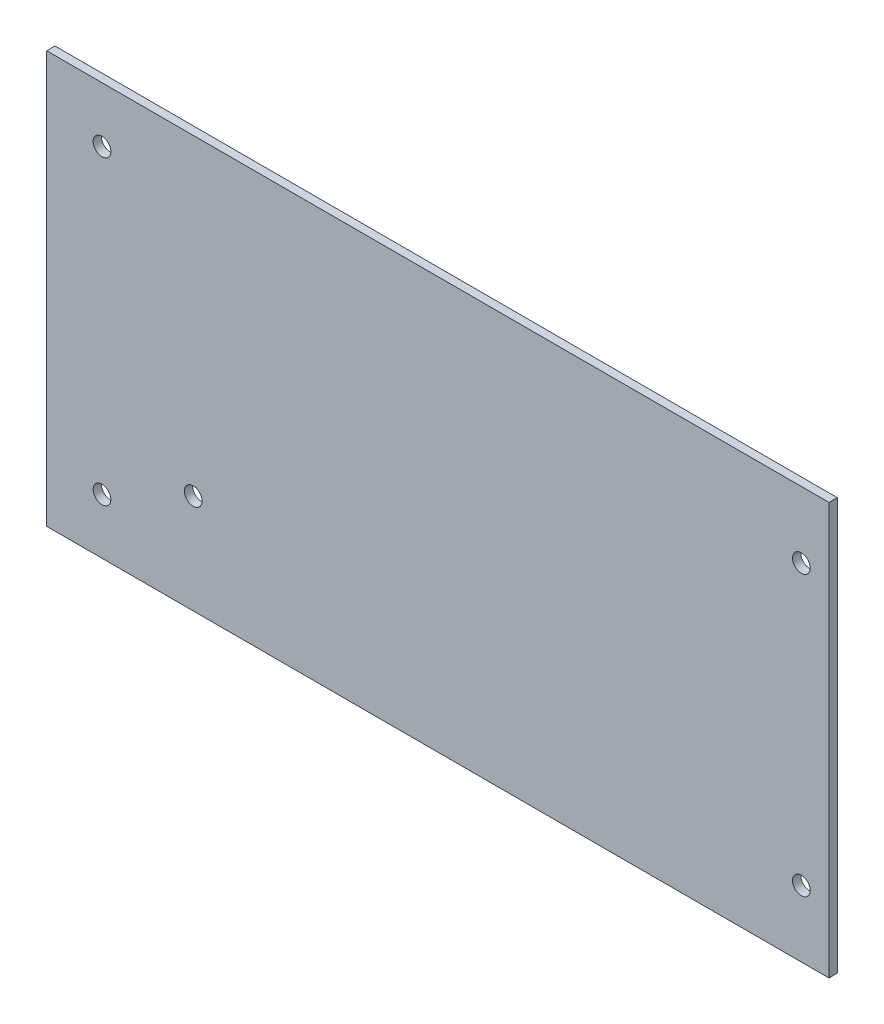
ISO-10303-21;
HEADER;
FILE_DESCRIPTION(('STEP AP214'),'2;1');
FILE_NAME('part.step','',(''),(''),'','','');
FILE_SCHEMA(('AUTOMOTIVE_DESIGN { 1 0 10303 214 1 1 1 1 }'));
ENDSEC;
DATA;
#1=APPLICATION_CONTEXT('core data for automotive mechanical design processes');
#2=APPLICATION_PROTOCOL_DEFINITION('international standard','automotive_design',2000,#1);
#3=PRODUCT_CONTEXT('',#1,'mechanical');
#4=PRODUCT('Part','Part','',(#3));
#5=PRODUCT_RELATED_PRODUCT_CATEGORY('part','',(#4));
#6=PRODUCT_DEFINITION_FORMATION('','',#4);
#7=PRODUCT_DEFINITION_CONTEXT('part definition',#1,'design');
#8=PRODUCT_DEFINITION('design','',#6,#7);
#9=PRODUCT_DEFINITION_SHAPE('','',#8);
#10=(LENGTH_UNIT() NAMED_UNIT(*) SI_UNIT(.MILLI.,.METRE.));
#11=(NAMED_UNIT(*) PLANE_ANGLE_UNIT() SI_UNIT($,.RADIAN.));
#12=(NAMED_UNIT(*) SI_UNIT($,.STERADIAN.) SOLID_ANGLE_UNIT());
#13=UNCERTAINTY_MEASURE_WITH_UNIT(LENGTH_MEASURE(1.E-05),#10,'distance_accuracy_value','');
#14=(GEOMETRIC_REPRESENTATION_CONTEXT(3) GLOBAL_UNCERTAINTY_ASSIGNED_CONTEXT((#13)) GLOBAL_UNIT_ASSIGNED_CONTEXT((#10,
#11,#12)) REPRESENTATION_CONTEXT('',''));
#15=CARTESIAN_POINT('',(0.,0.,0.));
#16=DIRECTION('',(0.,0.,1.));
#17=DIRECTION('',(1.,0.,0.));
#18=AXIS2_PLACEMENT_3D('',#15,#16,#17);
#19=CARTESIAN_POINT('',(-69.9627673140526,74.5,1.5));
#20=DIRECTION('',(1.,0.,0.));
#21=DIRECTION('',(0.,1.,0.));
#22=AXIS2_PLACEMENT_3D('',#19,#20,#21);
#23=PLANE('',#22);
#24=DIRECTION('',(0.,-1.,0.));
#25=VECTOR('',#24,1.);
#26=CARTESIAN_POINT('',(-69.9627673140526,74.5,0.));
#27=LINE('',#26,#25);
#28=CARTESIAN_POINT('',(-69.9627673140526,74.5,0.));
#29=VERTEX_POINT('',#28);
#30=CARTESIAN_POINT('',(-69.9627673140526,0.,0.));
#31=VERTEX_POINT('',#30);
#32=EDGE_CURVE('E95',#29,#31,#27,.T.);
#33=ORIENTED_EDGE('',*,*,#32,.T.);
#34=DIRECTION('',(0.,0.,-1.));
#35=VECTOR('',#34,1.);
#36=CARTESIAN_POINT('',(-69.9627673140526,0.,1.5));
#37=LINE('',#36,#35);
#38=CARTESIAN_POINT('',(-69.9627673140526,0.,1.5));
#39=VERTEX_POINT('',#38);
#40=EDGE_CURVE('E11',#39,#31,#37,.T.);
#41=ORIENTED_EDGE('',*,*,#40,.F.);
#42=DIRECTION('',(0.,-1.,0.));
#43=VECTOR('',#42,1.);
#44=CARTESIAN_POINT('',(-69.9627673140526,74.5,1.5));
#45=LINE('',#44,#43);
#46=CARTESIAN_POINT('',(-69.9627673140526,74.5,1.5));
#47=VERTEX_POINT('',#46);
#48=EDGE_CURVE('E83',#47,#39,#45,.T.);
#49=ORIENTED_EDGE('',*,*,#48,.F.);
#50=DIRECTION('',(0.,0.,-1.));
#51=VECTOR('',#50,1.);
#52=CARTESIAN_POINT('',(-69.9627673140526,74.5,1.5));
#53=LINE('',#52,#51);
#54=EDGE_CURVE('E91',#47,#29,#53,.T.);
#55=ORIENTED_EDGE('',*,*,#54,.T.);
#56=EDGE_LOOP('',(#33,#41,#49,#55));
#57=FACE_BOUND('',#56,.T.);
#58=ADVANCED_FACE('F32',(#57),#23,.F.);
#59=CARTESIAN_POINT('',(-69.9627673140526,0.,1.5));
#60=DIRECTION('',(0.,1.,0.));
#61=DIRECTION('',(0.,0.,1.));
#62=AXIS2_PLACEMENT_3D('',#59,#60,#61);
#63=PLANE('',#62);
#64=DIRECTION('',(1.,0.,0.));
#65=VECTOR('',#64,1.);
#66=CARTESIAN_POINT('',(-69.9627673140526,0.,0.));
#67=LINE('',#66,#65);
#68=CARTESIAN_POINT('',(71.5372326859474,0.,0.));
#69=VERTEX_POINT('',#68);
#70=EDGE_CURVE('E87',#31,#69,#67,.T.);
#71=ORIENTED_EDGE('',*,*,#70,.T.);
#72=DIRECTION('',(0.,0.,-1.));
#73=VECTOR('',#72,1.);
#74=CARTESIAN_POINT('',(71.5372326859474,0.,1.5));
#75=LINE('',#74,#73);
#76=CARTESIAN_POINT('',(71.5372326859474,0.,1.5));
#77=VERTEX_POINT('',#76);
#78=EDGE_CURVE('E40',#77,#69,#75,.T.);
#79=ORIENTED_EDGE('',*,*,#78,.F.);
#80=DIRECTION('',(1.,0.,0.));
#81=VECTOR('',#80,1.);
#82=CARTESIAN_POINT('',(-69.9627673140526,0.,1.5));
#83=LINE('',#82,#81);
#84=EDGE_CURVE('E78',#39,#77,#83,.T.);
#85=ORIENTED_EDGE('',*,*,#84,.F.);
#86=ORIENTED_EDGE('',*,*,#40,.T.);
#87=EDGE_LOOP('',(#71,#79,#85,#86));
#88=FACE_BOUND('',#87,.T.);
#89=ADVANCED_FACE('F86',(#88),#63,.F.);
#90=CARTESIAN_POINT('',(71.5372326859474,74.5,1.5));
#91=DIRECTION('',(-1.,0.,0.));
#92=DIRECTION('',(0.,-1.,0.));
#93=AXIS2_PLACEMENT_3D('',#90,#91,#92);
#94=PLANE('',#93);
#95=DIRECTION('',(0.,1.,0.));
#96=VECTOR('',#95,1.);
#97=CARTESIAN_POINT('',(71.5372326859474,74.5,0.));
#98=LINE('',#97,#96);
#99=CARTESIAN_POINT('',(71.5372326859474,74.5,0.));
#100=VERTEX_POINT('',#99);
#101=EDGE_CURVE('E65',#69,#100,#98,.T.);
#102=ORIENTED_EDGE('',*,*,#101,.T.);
#103=DIRECTION('',(0.,0.,-1.));
#104=VECTOR('',#103,1.);
#105=CARTESIAN_POINT('',(71.5372326859474,74.5,1.5));
#106=LINE('',#105,#104);
#107=CARTESIAN_POINT('',(71.5372326859474,74.5,1.5));
#108=VERTEX_POINT('',#107);
#109=EDGE_CURVE('E88',#108,#100,#106,.T.);
#110=ORIENTED_EDGE('',*,*,#109,.F.);
#111=DIRECTION('',(0.,1.,0.));
#112=VECTOR('',#111,1.);
#113=CARTESIAN_POINT('',(71.5372326859474,74.5,1.5));
#114=LINE('',#113,#112);
#115=EDGE_CURVE('E81',#77,#108,#114,.T.);
#116=ORIENTED_EDGE('',*,*,#115,.F.);
#117=ORIENTED_EDGE('',*,*,#78,.T.);
#118=EDGE_LOOP('',(#102,#110,#116,#117));
#119=FACE_BOUND('',#118,.T.);
#120=ADVANCED_FACE('F89',(#119),#94,.F.);
#121=CARTESIAN_POINT('',(-69.9627673140526,74.5,1.5));
#122=DIRECTION('',(0.,-1.,0.));
#123=DIRECTION('',(0.,0.,-1.));
#124=AXIS2_PLACEMENT_3D('',#121,#122,#123);
#125=PLANE('',#124);
#126=DIRECTION('',(-1.,0.,0.));
#127=VECTOR('',#126,1.);
#128=CARTESIAN_POINT('',(-69.9627673140526,74.5,0.));
#129=LINE('',#128,#127);
#130=EDGE_CURVE('E71',#100,#29,#129,.T.);
#131=ORIENTED_EDGE('',*,*,#130,.T.);
#132=ORIENTED_EDGE('',*,*,#54,.F.);
#133=DIRECTION('',(-1.,0.,0.));
#134=VECTOR('',#133,1.);
#135=CARTESIAN_POINT('',(-69.9627673140526,74.5,1.5));
#136=LINE('',#135,#134);
#137=EDGE_CURVE('E48',#108,#47,#136,.T.);
#138=ORIENTED_EDGE('',*,*,#137,.F.);
#139=ORIENTED_EDGE('',*,*,#109,.T.);
#140=EDGE_LOOP('',(#131,#132,#138,#139));
#141=FACE_BOUND('',#140,.T.);
#142=ADVANCED_FACE('F103',(#141),#125,.F.);
#143=CARTESIAN_POINT('',(0.,0.,1.5));
#144=DIRECTION('',(0.,0.,1.));
#145=DIRECTION('',(1.,0.,0.));
#146=AXIS2_PLACEMENT_3D('',#143,#144,#145);
#147=PLANE('',#146);
#148=CARTESIAN_POINT('',(-43.4627673140517,17.9999999999963,1.5));
#149=DIRECTION('',(0.,0.,1.));
#150=DIRECTION('',(1.,0.,0.));
#151=AXIS2_PLACEMENT_3D('',#148,#149,#150);
#152=CIRCLE('',#151,1.6);
#153=CARTESIAN_POINT('',(-41.8627673140517,17.9999999999963,1.5));
#154=VERTEX_POINT('',#153);
#155=EDGE_CURVE('E133',#154,#154,#152,.T.);
#156=ORIENTED_EDGE('',*,*,#155,.F.);
#157=EDGE_LOOP('',(#156));
#158=FACE_BOUND('',#157,.T.);
#159=CARTESIAN_POINT('',(66.5372326859474,12.,1.5));
#160=DIRECTION('',(0.,0.,1.));
#161=DIRECTION('',(1.,0.,0.));
#162=AXIS2_PLACEMENT_3D('',#159,#160,#161);
#163=CIRCLE('',#162,1.6);
#164=CARTESIAN_POINT('',(68.1372326859474,12.,1.5));
#165=VERTEX_POINT('',#164);
#166=EDGE_CURVE('E127',#165,#165,#163,.T.);
#167=ORIENTED_EDGE('',*,*,#166,.F.);
#168=EDGE_LOOP('',(#167));
#169=FACE_BOUND('',#168,.T.);
#170=CARTESIAN_POINT('',(66.5372326859474,62.5,1.5));
#171=DIRECTION('',(0.,0.,1.));
#172=DIRECTION('',(1.,0.,0.));
#173=AXIS2_PLACEMENT_3D('',#170,#171,#172);
#174=CIRCLE('',#173,1.60000000000001);
#175=CARTESIAN_POINT('',(68.1372326859474,62.5,1.5));
#176=VERTEX_POINT('',#175);
#177=EDGE_CURVE('E121',#176,#176,#174,.T.);
#178=ORIENTED_EDGE('',*,*,#177,.F.);
#179=EDGE_LOOP('',(#178));
#180=FACE_BOUND('',#179,.T.);
#181=CARTESIAN_POINT('',(-59.9627673140526,9.99999999999999,1.5));
#182=DIRECTION('',(0.,0.,1.));
#183=DIRECTION('',(1.,0.,0.));
#184=AXIS2_PLACEMENT_3D('',#181,#182,#183);
#185=CIRCLE('',#184,1.6);
#186=CARTESIAN_POINT('',(-58.3627673140526,9.99999999999999,1.5));
#187=VERTEX_POINT('',#186);
#188=EDGE_CURVE('E115',#187,#187,#185,.T.);
#189=ORIENTED_EDGE('',*,*,#188,.F.);
#190=EDGE_LOOP('',(#189));
#191=FACE_BOUND('',#190,.T.);
#192=CARTESIAN_POINT('',(-59.9627673140526,64.5,1.5));
#193=DIRECTION('',(0.,0.,1.));
#194=DIRECTION('',(1.,0.,0.));
#195=AXIS2_PLACEMENT_3D('',#192,#193,#194);
#196=CIRCLE('',#195,1.60000000000001);
#197=CARTESIAN_POINT('',(-58.3627673140526,64.5,1.5));
#198=VERTEX_POINT('',#197);
#199=EDGE_CURVE('E109',#198,#198,#196,.T.);
#200=ORIENTED_EDGE('',*,*,#199,.F.);
#201=EDGE_LOOP('',(#200));
#202=FACE_BOUND('',#201,.T.);
#203=ORIENTED_EDGE('',*,*,#48,.T.);
#204=ORIENTED_EDGE('',*,*,#84,.T.);
#205=ORIENTED_EDGE('',*,*,#115,.T.);
#206=ORIENTED_EDGE('',*,*,#137,.T.);
#207=EDGE_LOOP('',(#203,#204,#205,#206));
#208=FACE_BOUND('',#207,.T.);
#209=ADVANCED_FACE('F79',(#158,#169,#180,#191,#202,#208),#147,.T.);
#210=CARTESIAN_POINT('',(0.,0.,0.));
#211=DIRECTION('',(0.,0.,1.));
#212=DIRECTION('',(1.,0.,0.));
#213=AXIS2_PLACEMENT_3D('',#210,#211,#212);
#214=PLANE('',#213);
#215=CARTESIAN_POINT('',(-43.4627673140517,17.9999999999963,0.));
#216=DIRECTION('',(0.,0.,1.));
#217=DIRECTION('',(1.,0.,0.));
#218=AXIS2_PLACEMENT_3D('',#215,#216,#217);
#219=CIRCLE('',#218,1.6);
#220=CARTESIAN_POINT('',(-41.8627673140517,17.9999999999963,0.));
#221=VERTEX_POINT('',#220);
#222=EDGE_CURVE('E130',#221,#221,#219,.T.);
#223=ORIENTED_EDGE('',*,*,#222,.T.);
#224=EDGE_LOOP('',(#223));
#225=FACE_BOUND('',#224,.T.);
#226=CARTESIAN_POINT('',(66.5372326859474,12.,0.));
#227=DIRECTION('',(0.,0.,1.));
#228=DIRECTION('',(1.,0.,0.));
#229=AXIS2_PLACEMENT_3D('',#226,#227,#228);
#230=CIRCLE('',#229,1.6);
#231=CARTESIAN_POINT('',(68.1372326859474,12.,0.));
#232=VERTEX_POINT('',#231);
#233=EDGE_CURVE('E124',#232,#232,#230,.T.);
#234=ORIENTED_EDGE('',*,*,#233,.T.);
#235=EDGE_LOOP('',(#234));
#236=FACE_BOUND('',#235,.T.);
#237=CARTESIAN_POINT('',(66.5372326859474,62.5,0.));
#238=DIRECTION('',(0.,0.,1.));
#239=DIRECTION('',(1.,0.,0.));
#240=AXIS2_PLACEMENT_3D('',#237,#238,#239);
#241=CIRCLE('',#240,1.60000000000001);
#242=CARTESIAN_POINT('',(68.1372326859474,62.5,0.));
#243=VERTEX_POINT('',#242);
#244=EDGE_CURVE('E118',#243,#243,#241,.T.);
#245=ORIENTED_EDGE('',*,*,#244,.T.);
#246=EDGE_LOOP('',(#245));
#247=FACE_BOUND('',#246,.T.);
#248=CARTESIAN_POINT('',(-59.9627673140526,9.99999999999999,0.));
#249=DIRECTION('',(0.,0.,1.));
#250=DIRECTION('',(1.,0.,0.));
#251=AXIS2_PLACEMENT_3D('',#248,#249,#250);
#252=CIRCLE('',#251,1.6);
#253=CARTESIAN_POINT('',(-58.3627673140526,9.99999999999999,0.));
#254=VERTEX_POINT('',#253);
#255=EDGE_CURVE('E112',#254,#254,#252,.T.);
#256=ORIENTED_EDGE('',*,*,#255,.T.);
#257=EDGE_LOOP('',(#256));
#258=FACE_BOUND('',#257,.T.);
#259=CARTESIAN_POINT('',(-59.9627673140526,64.5,0.));
#260=DIRECTION('',(0.,0.,1.));
#261=DIRECTION('',(1.,0.,0.));
#262=AXIS2_PLACEMENT_3D('',#259,#260,#261);
#263=CIRCLE('',#262,1.60000000000001);
#264=CARTESIAN_POINT('',(-58.3627673140526,64.5,0.));
#265=VERTEX_POINT('',#264);
#266=EDGE_CURVE('E98',#265,#265,#263,.T.);
#267=ORIENTED_EDGE('',*,*,#266,.T.);
#268=EDGE_LOOP('',(#267));
#269=FACE_BOUND('',#268,.T.);
#270=ORIENTED_EDGE('',*,*,#32,.F.);
#271=ORIENTED_EDGE('',*,*,#130,.F.);
#272=ORIENTED_EDGE('',*,*,#101,.F.);
#273=ORIENTED_EDGE('',*,*,#70,.F.);
#274=EDGE_LOOP('',(#270,#271,#272,#273));
#275=FACE_BOUND('',#274,.T.);
#276=ADVANCED_FACE('F106',(#225,#236,#247,#258,#269,#275),#214,.F.);
#277=CARTESIAN_POINT('',(-59.9627673140526,64.5,0.));
#278=DIRECTION('',(0.,0.,1.));
#279=DIRECTION('',(1.,0.,0.));
#280=AXIS2_PLACEMENT_3D('',#277,#278,#279);
#281=CYLINDRICAL_SURFACE('',#280,1.60000000000001);
#282=ORIENTED_EDGE('',*,*,#266,.F.);
#283=EDGE_LOOP('',(#282));
#284=FACE_BOUND('',#283,.T.);
#285=ORIENTED_EDGE('',*,*,#199,.T.);
#286=EDGE_LOOP('',(#285));
#287=FACE_BOUND('',#286,.T.);
#288=ADVANCED_FACE('F159',(#284,#287),#281,.F.);
#289=CARTESIAN_POINT('',(-59.9627673140526,9.99999999999999,0.));
#290=DIRECTION('',(0.,0.,1.));
#291=DIRECTION('',(1.,0.,0.));
#292=AXIS2_PLACEMENT_3D('',#289,#290,#291);
#293=CYLINDRICAL_SURFACE('',#292,1.6);
#294=ORIENTED_EDGE('',*,*,#255,.F.);
#295=EDGE_LOOP('',(#294));
#296=FACE_BOUND('',#295,.T.);
#297=ORIENTED_EDGE('',*,*,#188,.T.);
#298=EDGE_LOOP('',(#297));
#299=FACE_BOUND('',#298,.T.);
#300=ADVANCED_FACE('F161',(#296,#299),#293,.F.);
#301=CARTESIAN_POINT('',(66.5372326859474,62.5,0.));
#302=DIRECTION('',(0.,0.,1.));
#303=DIRECTION('',(1.,0.,0.));
#304=AXIS2_PLACEMENT_3D('',#301,#302,#303);
#305=CYLINDRICAL_SURFACE('',#304,1.60000000000001);
#306=ORIENTED_EDGE('',*,*,#244,.F.);
#307=EDGE_LOOP('',(#306));
#308=FACE_BOUND('',#307,.T.);
#309=ORIENTED_EDGE('',*,*,#177,.T.);
#310=EDGE_LOOP('',(#309));
#311=FACE_BOUND('',#310,.T.);
#312=ADVANCED_FACE('F168',(#308,#311),#305,.F.);
#313=CARTESIAN_POINT('',(66.5372326859474,12.,0.));
#314=DIRECTION('',(0.,0.,1.));
#315=DIRECTION('',(1.,0.,0.));
#316=AXIS2_PLACEMENT_3D('',#313,#314,#315);
#317=CYLINDRICAL_SURFACE('',#316,1.6);
#318=ORIENTED_EDGE('',*,*,#233,.F.);
#319=EDGE_LOOP('',(#318));
#320=FACE_BOUND('',#319,.T.);
#321=ORIENTED_EDGE('',*,*,#166,.T.);
#322=EDGE_LOOP('',(#321));
#323=FACE_BOUND('',#322,.T.);
#324=ADVANCED_FACE('F144',(#320,#323),#317,.F.);
#325=CARTESIAN_POINT('',(-43.4627673140517,17.9999999999963,0.));
#326=DIRECTION('',(0.,0.,1.));
#327=DIRECTION('',(1.,0.,0.));
#328=AXIS2_PLACEMENT_3D('',#325,#326,#327);
#329=CYLINDRICAL_SURFACE('',#328,1.6);
#330=ORIENTED_EDGE('',*,*,#222,.F.);
#331=EDGE_LOOP('',(#330));
#332=FACE_BOUND('',#331,.T.);
#333=ORIENTED_EDGE('',*,*,#155,.T.);
#334=EDGE_LOOP('',(#333));
#335=FACE_BOUND('',#334,.T.);
#336=ADVANCED_FACE('F141',(#332,#335),#329,.F.);
#337=CLOSED_SHELL('',(#58,#89,#120,#142,#209,#276,#288,#300,#312,#324,#336));
#338=MANIFOLD_SOLID_BREP('B2',#337);
#339=ADVANCED_BREP_SHAPE_REPRESENTATION('',(#18,#338),#14);
#340=SHAPE_DEFINITION_REPRESENTATION(#9,#339);
ENDSEC;
END-ISO-10303-21;
